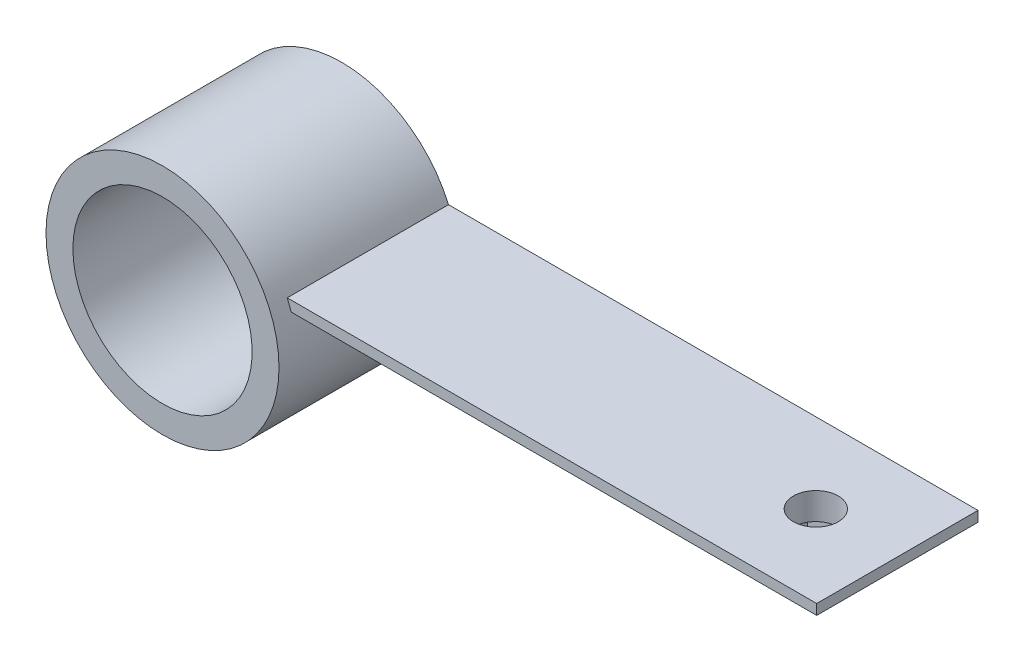
ISO-10303-21;
HEADER;
FILE_DESCRIPTION(('STEP AP214'),'2;1');
FILE_NAME('part.step','',(''),(''),'','','');
FILE_SCHEMA(('AUTOMOTIVE_DESIGN { 1 0 10303 214 1 1 1 1 }'));
ENDSEC;
DATA;
#1=APPLICATION_CONTEXT('core data for automotive mechanical design processes');
#2=APPLICATION_PROTOCOL_DEFINITION('international standard','automotive_design',2000,#1);
#3=PRODUCT_CONTEXT('',#1,'mechanical');
#4=PRODUCT('Part','Part','',(#3));
#5=PRODUCT_RELATED_PRODUCT_CATEGORY('part','',(#4));
#6=PRODUCT_DEFINITION_FORMATION('','',#4);
#7=PRODUCT_DEFINITION_CONTEXT('part definition',#1,'design');
#8=PRODUCT_DEFINITION('design','',#6,#7);
#9=PRODUCT_DEFINITION_SHAPE('','',#8);
#10=(LENGTH_UNIT() NAMED_UNIT(*) SI_UNIT(.MILLI.,.METRE.));
#11=(NAMED_UNIT(*) PLANE_ANGLE_UNIT() SI_UNIT($,.RADIAN.));
#12=(NAMED_UNIT(*) SI_UNIT($,.STERADIAN.) SOLID_ANGLE_UNIT());
#13=UNCERTAINTY_MEASURE_WITH_UNIT(LENGTH_MEASURE(1.E-05),#10,'distance_accuracy_value','');
#14=(GEOMETRIC_REPRESENTATION_CONTEXT(3) GLOBAL_UNCERTAINTY_ASSIGNED_CONTEXT((#13)) GLOBAL_UNIT_ASSIGNED_CONTEXT((#10,
#11,#12)) REPRESENTATION_CONTEXT('',''));
#15=CARTESIAN_POINT('',(0.,0.,0.));
#16=DIRECTION('',(0.,0.,1.));
#17=DIRECTION('',(1.,0.,0.));
#18=AXIS2_PLACEMENT_3D('',#15,#16,#17);
#19=CARTESIAN_POINT('',(-25.4,0.,3.81));
#20=DIRECTION('',(0.,-1.,0.));
#21=DIRECTION('',(0.,0.,-1.));
#22=AXIS2_PLACEMENT_3D('',#19,#20,#21);
#23=PLANE('',#22);
#24=CARTESIAN_POINT('',(-14.2191135768376,0.,11.3054432115813));
#25=DIRECTION('',(0.,-1.,0.));
#26=DIRECTION('',(0.,0.,-1.));
#27=AXIS2_PLACEMENT_3D('',#24,#25,#26);
#28=CIRCLE('',#27,3.175);
#29=CARTESIAN_POINT('',(-14.2191135768376,0.,8.13044321158129));
#30=VERTEX_POINT('',#29);
#31=EDGE_CURVE('E43',#30,#30,#28,.T.);
#32=ORIENTED_EDGE('',*,*,#31,.T.);
#33=EDGE_LOOP('',(#32));
#34=FACE_BOUND('',#33,.T.);
#35=DIRECTION('',(0.,0.,-1.));
#36=VECTOR('',#35,1.);
#37=CARTESIAN_POINT('',(-77.5762033844775,0.,25.4));
#38=LINE('',#37,#36);
#39=CARTESIAN_POINT('',(-77.5762033844775,0.,22.86));
#40=VERTEX_POINT('',#39);
#41=CARTESIAN_POINT('',(-77.5762033844775,0.,0.));
#42=VERTEX_POINT('',#41);
#43=EDGE_CURVE('E158',#40,#42,#38,.T.);
#44=ORIENTED_EDGE('',*,*,#43,.F.);
#45=DIRECTION('',(-1.,0.,0.));
#46=VECTOR('',#45,1.);
#47=CARTESIAN_POINT('',(-2.54,0.,22.86));
#48=LINE('',#47,#46);
#49=CARTESIAN_POINT('',(-2.54,0.,22.86));
#50=VERTEX_POINT('',#49);
#51=EDGE_CURVE('E140',#50,#40,#48,.T.);
#52=ORIENTED_EDGE('',*,*,#51,.F.);
#53=DIRECTION('',(0.,0.,-1.));
#54=VECTOR('',#53,1.);
#55=CARTESIAN_POINT('',(-2.54,0.,3.81));
#56=LINE('',#55,#54);
#57=CARTESIAN_POINT('',(-2.54,0.,0.));
#58=VERTEX_POINT('',#57);
#59=EDGE_CURVE('E266',#50,#58,#56,.T.);
#60=ORIENTED_EDGE('',*,*,#59,.T.);
#61=DIRECTION('',(-1.,0.,0.));
#62=VECTOR('',#61,1.);
#63=CARTESIAN_POINT('',(-25.4,0.,0.));
#64=LINE('',#63,#62);
#65=EDGE_CURVE('E167',#58,#42,#64,.T.);
#66=ORIENTED_EDGE('',*,*,#65,.T.);
#67=EDGE_LOOP('',(#44,#52,#60,#66));
#68=FACE_BOUND('',#67,.T.);
#69=ADVANCED_FACE('F39',(#34,#68),#23,.F.);
#70=CARTESIAN_POINT('',(-22.86,-3.81,22.86));
#71=DIRECTION('',(0.,1.,0.));
#72=DIRECTION('',(0.,0.,1.));
#73=AXIS2_PLACEMENT_3D('',#70,#71,#72);
#74=PLANE('',#73);
#75=CARTESIAN_POINT('',(-14.2191135768376,-3.81,11.3054432115813));
#76=DIRECTION('',(0.,-1.,0.));
#77=DIRECTION('',(0.,0.,-1.));
#78=AXIS2_PLACEMENT_3D('',#75,#76,#77);
#79=CIRCLE('',#78,3.175);
#80=CARTESIAN_POINT('',(-14.2191135768376,-3.81,8.13044321158129));
#81=VERTEX_POINT('',#80);
#82=EDGE_CURVE('E305',#81,#81,#79,.T.);
#83=ORIENTED_EDGE('',*,*,#82,.F.);
#84=EDGE_LOOP('',(#83));
#85=FACE_BOUND('',#84,.T.);
#86=DIRECTION('',(0.,0.,-1.));
#87=VECTOR('',#86,1.);
#88=CARTESIAN_POINT('',(-49.53,-3.81000000000006,3.81));
#89=LINE('',#88,#87);
#90=CARTESIAN_POINT('',(-49.53,-3.81000000000003,13.1982271536748));
#91=VERTEX_POINT('',#90);
#92=CARTESIAN_POINT('',(-49.53,-3.81000000000006,3.81));
#93=VERTEX_POINT('',#92);
#94=EDGE_CURVE('E187',#91,#93,#89,.T.);
#95=ORIENTED_EDGE('',*,*,#94,.T.);
#96=DIRECTION('',(1.,0.,0.));
#97=VECTOR('',#96,1.);
#98=CARTESIAN_POINT('',(-76.2,-3.81000000000002,3.81));
#99=LINE('',#98,#97);
#100=CARTESIAN_POINT('',(-25.4,-3.81000000000002,3.81));
#101=VERTEX_POINT('',#100);
#102=EDGE_CURVE('E238',#93,#101,#99,.T.);
#103=ORIENTED_EDGE('',*,*,#102,.T.);
#104=DIRECTION('',(0.,0.,1.));
#105=VECTOR('',#104,1.);
#106=CARTESIAN_POINT('',(-25.4,-3.81000000000002,22.86));
#107=LINE('',#106,#105);
#108=CARTESIAN_POINT('',(-25.4,-3.80999999999999,13.1982271536748));
#109=VERTEX_POINT('',#108);
#110=EDGE_CURVE('E234',#101,#109,#107,.T.);
#111=ORIENTED_EDGE('',*,*,#110,.T.);
#112=DIRECTION('',(1.,0.,0.));
#113=VECTOR('',#112,1.);
#114=CARTESIAN_POINT('',(-98.5726760431856,-3.81000000000002,13.1982271536748));
#115=LINE('',#114,#113);
#116=CARTESIAN_POINT('',(-22.86,-3.80999999999999,13.1982271536748));
#117=VERTEX_POINT('',#116);
#118=EDGE_CURVE('E203',#109,#117,#115,.T.);
#119=ORIENTED_EDGE('',*,*,#118,.T.);
#120=DIRECTION('',(0.,0.,-1.));
#121=VECTOR('',#120,1.);
#122=CARTESIAN_POINT('',(-22.86,-3.81,22.86));
#123=LINE('',#122,#121);
#124=CARTESIAN_POINT('',(-22.86,-3.81,3.81));
#125=VERTEX_POINT('',#124);
#126=EDGE_CURVE('E259',#117,#125,#123,.T.);
#127=ORIENTED_EDGE('',*,*,#126,.T.);
#128=DIRECTION('',(1.,0.,0.));
#129=VECTOR('',#128,1.);
#130=CARTESIAN_POINT('',(-22.86,-3.81,3.81));
#131=LINE('',#130,#129);
#132=CARTESIAN_POINT('',(-6.59911357683752,-3.81,3.81));
#133=VERTEX_POINT('',#132);
#134=EDGE_CURVE('E152',#125,#133,#131,.T.);
#135=ORIENTED_EDGE('',*,*,#134,.T.);
#136=DIRECTION('',(0.,0.,-1.));
#137=VECTOR('',#136,1.);
#138=CARTESIAN_POINT('',(-6.59911357683771,-3.81,22.86));
#139=LINE('',#138,#137);
#140=CARTESIAN_POINT('',(-6.59911357683753,-3.80999999999999,18.8008864231626));
#141=VERTEX_POINT('',#140);
#142=EDGE_CURVE('E64',#141,#133,#139,.T.);
#143=ORIENTED_EDGE('',*,*,#142,.F.);
#144=DIRECTION('',(1.,0.,0.));
#145=VECTOR('',#144,1.);
#146=CARTESIAN_POINT('',(-98.5726760431856,-3.81000000000002,18.8008864231626));
#147=LINE('',#146,#145);
#148=CARTESIAN_POINT('',(-76.4372944641802,-3.81000000000002,18.8008864231626));
#149=VERTEX_POINT('',#148);
#150=EDGE_CURVE('E211',#149,#141,#147,.T.);
#151=ORIENTED_EDGE('',*,*,#150,.F.);
#152=DIRECTION('',(0.,0.,1.));
#153=VECTOR('',#152,1.);
#154=CARTESIAN_POINT('',(-76.4372944641802,-3.81000000000002,-2.93108565109848));
#155=LINE('',#154,#153);
#156=CARTESIAN_POINT('',(-76.4372944641802,-3.81000000000002,3.81));
#157=VERTEX_POINT('',#156);
#158=EDGE_CURVE('E164',#157,#149,#155,.T.);
#159=ORIENTED_EDGE('',*,*,#158,.F.);
#160=CARTESIAN_POINT('',(-52.07,-3.81000000000002,3.81));
#161=VERTEX_POINT('',#160);
#162=EDGE_CURVE('E239',#157,#161,#99,.T.);
#163=ORIENTED_EDGE('',*,*,#162,.T.);
#164=DIRECTION('',(0.,0.,-1.));
#165=VECTOR('',#164,1.);
#166=CARTESIAN_POINT('',(-52.07,-3.81000000000006,3.81));
#167=LINE('',#166,#165);
#168=CARTESIAN_POINT('',(-52.07,-3.81000000000003,13.1982271536748));
#169=VERTEX_POINT('',#168);
#170=EDGE_CURVE('E56',#169,#161,#167,.T.);
#171=ORIENTED_EDGE('',*,*,#170,.F.);
#172=DIRECTION('',(-1.,0.,0.));
#173=VECTOR('',#172,1.);
#174=CARTESIAN_POINT('',(-49.53,-3.81000000000003,13.1982271536748));
#175=LINE('',#174,#173);
#176=EDGE_CURVE('E200',#91,#169,#175,.T.);
#177=ORIENTED_EDGE('',*,*,#176,.F.);
#178=EDGE_LOOP('',(#95,#103,#111,#119,#127,#135,#143,#151,#159,#163,#171,#177));
#179=FACE_BOUND('',#178,.T.);
#180=ADVANCED_FACE('F322',(#85,#179),#74,.F.);
#181=CARTESIAN_POINT('',(-76.2,-13.1982271536747,3.81));
#182=DIRECTION('',(0.,0.,-1.));
#183=DIRECTION('',(-1.,0.,0.));
#184=AXIS2_PLACEMENT_3D('',#181,#182,#183);
#185=PLANE('',#184);
#186=DIRECTION('',(0.,-1.,0.));
#187=VECTOR('',#186,1.);
#188=CARTESIAN_POINT('',(-49.53,-13.1982271536747,3.81));
#189=LINE('',#188,#187);
#190=CARTESIAN_POINT('',(-49.53,-13.1982271536747,3.81));
#191=VERTEX_POINT('',#190);
#192=EDGE_CURVE('E191',#93,#191,#189,.T.);
#193=ORIENTED_EDGE('',*,*,#192,.T.);
#194=DIRECTION('',(1.,0.,0.));
#195=VECTOR('',#194,1.);
#196=CARTESIAN_POINT('',(-76.2,-13.1982271536747,3.81));
#197=LINE('',#196,#195);
#198=CARTESIAN_POINT('',(-25.4,-13.1982271536747,3.81));
#199=VERTEX_POINT('',#198);
#200=EDGE_CURVE('E243',#191,#199,#197,.T.);
#201=ORIENTED_EDGE('',*,*,#200,.T.);
#202=DIRECTION('',(0.,1.,0.));
#203=VECTOR('',#202,1.);
#204=CARTESIAN_POINT('',(-25.4,-13.1982271536747,3.81));
#205=LINE('',#204,#203);
#206=EDGE_CURVE('E230',#199,#101,#205,.T.);
#207=ORIENTED_EDGE('',*,*,#206,.T.);
#208=ORIENTED_EDGE('',*,*,#102,.F.);
#209=EDGE_LOOP('',(#193,#201,#207,#208));
#210=FACE_BOUND('',#209,.T.);
#211=ADVANCED_FACE('F340',(#210),#185,.F.);
#212=CARTESIAN_POINT('',(-25.4,-13.1982271536747,3.81));
#213=DIRECTION('',(1.,0.,0.));
#214=DIRECTION('',(0.,1.,0.));
#215=AXIS2_PLACEMENT_3D('',#212,#213,#214);
#216=PLANE('',#215);
#217=ORIENTED_EDGE('',*,*,#206,.F.);
#218=DIRECTION('',(0.,0.707106781186544,0.707106781186551));
#219=VECTOR('',#218,1.);
#220=CARTESIAN_POINT('',(-25.4,-13.1982271536747,3.81));
#221=LINE('',#220,#219);
#222=EDGE_CURVE('E226',#199,#109,#221,.T.);
#223=ORIENTED_EDGE('',*,*,#222,.T.);
#224=ORIENTED_EDGE('',*,*,#110,.F.);
#225=EDGE_LOOP('',(#217,#223,#224));
#226=FACE_BOUND('',#225,.T.);
#227=ADVANCED_FACE('F338',(#226),#216,.F.);
#228=CARTESIAN_POINT('',(0.,0.,3.81));
#229=DIRECTION('',(0.,0.,-1.));
#230=DIRECTION('',(-1.,0.,0.));
#231=AXIS2_PLACEMENT_3D('',#228,#229,#230);
#232=PLANE('',#231);
#233=ORIENTED_EDGE('',*,*,#134,.F.);
#234=DIRECTION('',(0.,1.,0.));
#235=VECTOR('',#234,1.);
#236=CARTESIAN_POINT('',(-22.86,-13.1982271536747,3.81));
#237=LINE('',#236,#235);
#238=CARTESIAN_POINT('',(-22.86,-13.1982271536747,3.81));
#239=VERTEX_POINT('',#238);
#240=EDGE_CURVE('E247',#239,#125,#237,.T.);
#241=ORIENTED_EDGE('',*,*,#240,.F.);
#242=DIRECTION('',(0.866025403784441,0.499999999999995,0.));
#243=VECTOR('',#242,1.);
#244=CARTESIAN_POINT('',(-2.53999999999999,-1.46646968374162,3.81));
#245=LINE('',#244,#243);
#246=EDGE_CURVE('E263',#239,#133,#245,.T.);
#247=ORIENTED_EDGE('',*,*,#246,.T.);
#248=EDGE_LOOP('',(#233,#241,#247));
#249=FACE_BOUND('',#248,.T.);
#250=ADVANCED_FACE('F327',(#249),#232,.F.);
#251=CARTESIAN_POINT('',(-25.4,-13.1982271536747,3.81));
#252=DIRECTION('',(0.,1.,0.));
#253=DIRECTION('',(-1.,0.,0.));
#254=AXIS2_PLACEMENT_3D('',#251,#252,#253);
#255=PLANE('',#254);
#256=CARTESIAN_POINT('',(-77.5762033844775,-13.1982271536747,3.81));
#257=VERTEX_POINT('',#256);
#258=CARTESIAN_POINT('',(-52.07,-13.1982271536747,3.81));
#259=VERTEX_POINT('',#258);
#260=EDGE_CURVE('E244',#257,#259,#197,.T.);
#261=ORIENTED_EDGE('',*,*,#260,.F.);
#262=DIRECTION('',(0.,0.,-1.));
#263=VECTOR('',#262,1.);
#264=CARTESIAN_POINT('',(-77.5762033844775,-13.1982271536747,25.4));
#265=LINE('',#264,#263);
#266=CARTESIAN_POINT('',(-77.5762033844775,-13.1982271536747,0.));
#267=VERTEX_POINT('',#266);
#268=EDGE_CURVE('E170',#257,#267,#265,.T.);
#269=ORIENTED_EDGE('',*,*,#268,.T.);
#270=DIRECTION('',(1.,0.,0.));
#271=VECTOR('',#270,1.);
#272=CARTESIAN_POINT('',(-25.4,-13.1982271536747,0.));
#273=LINE('',#272,#271);
#274=CARTESIAN_POINT('',(-22.86,-13.1982271536747,0.));
#275=VERTEX_POINT('',#274);
#276=EDGE_CURVE('E262',#267,#275,#273,.T.);
#277=ORIENTED_EDGE('',*,*,#276,.T.);
#278=DIRECTION('',(0.,0.,-1.));
#279=VECTOR('',#278,1.);
#280=CARTESIAN_POINT('',(-22.86,-13.1982271536747,3.81));
#281=LINE('',#280,#279);
#282=EDGE_CURVE('E11',#239,#275,#281,.T.);
#283=ORIENTED_EDGE('',*,*,#282,.F.);
#284=DIRECTION('',(1.,0.,0.));
#285=VECTOR('',#284,1.);
#286=CARTESIAN_POINT('',(-98.5726760431856,-13.1982271536747,3.81));
#287=LINE('',#286,#285);
#288=EDGE_CURVE('E210',#199,#239,#287,.T.);
#289=ORIENTED_EDGE('',*,*,#288,.F.);
#290=ORIENTED_EDGE('',*,*,#200,.F.);
#291=DIRECTION('',(-1.,0.,0.));
#292=VECTOR('',#291,1.);
#293=CARTESIAN_POINT('',(-49.53,-13.1982271536747,3.81));
#294=LINE('',#293,#292);
#295=EDGE_CURVE('E199',#191,#259,#294,.T.);
#296=ORIENTED_EDGE('',*,*,#295,.T.);
#297=EDGE_LOOP('',(#261,#269,#277,#283,#289,#290,#296));
#298=FACE_BOUND('',#297,.T.);
#299=ADVANCED_FACE('F41',(#298),#255,.F.);
#300=CARTESIAN_POINT('',(-2.53999999999999,-1.46646968374162,3.81));
#301=DIRECTION('',(-0.499999999999995,0.866025403784442,0.));
#302=DIRECTION('',(-0.866025403784442,-0.499999999999995,0.));
#303=AXIS2_PLACEMENT_3D('',#300,#301,#302);
#304=PLANE('',#303);
#305=DIRECTION('',(0.,0.,-1.));
#306=VECTOR('',#305,1.);
#307=CARTESIAN_POINT('',(-2.53999999999999,-1.46646968374162,3.81));
#308=LINE('',#307,#306);
#309=CARTESIAN_POINT('',(-2.53999999999995,-1.46646968374161,22.86));
#310=VERTEX_POINT('',#309);
#311=CARTESIAN_POINT('',(-2.53999999999999,-1.46646968374162,0.));
#312=VERTEX_POINT('',#311);
#313=EDGE_CURVE('E49',#310,#312,#308,.T.);
#314=ORIENTED_EDGE('',*,*,#313,.F.);
#315=DIRECTION('',(-0.654653670707985,-0.377964473009227,-0.654653670707969));
#316=VECTOR('',#315,1.);
#317=CARTESIAN_POINT('',(-10.7042857142857,-6.18012223862543,14.6957142857145));
#318=LINE('',#317,#316);
#319=EDGE_CURVE('E219',#310,#141,#318,.T.);
#320=ORIENTED_EDGE('',*,*,#319,.T.);
#321=ORIENTED_EDGE('',*,*,#142,.T.);
#322=ORIENTED_EDGE('',*,*,#246,.F.);
#323=ORIENTED_EDGE('',*,*,#282,.T.);
#324=DIRECTION('',(0.866025403784441,0.499999999999995,0.));
#325=VECTOR('',#324,1.);
#326=CARTESIAN_POINT('',(-2.53999999999999,-1.46646968374162,0.));
#327=LINE('',#326,#325);
#328=EDGE_CURVE('E270',#275,#312,#327,.T.);
#329=ORIENTED_EDGE('',*,*,#328,.T.);
#330=EDGE_LOOP('',(#314,#320,#321,#322,#323,#329));
#331=FACE_BOUND('',#330,.T.);
#332=ADVANCED_FACE('F321',(#331),#304,.F.);
#333=CARTESIAN_POINT('',(-2.54,0.,3.81));
#334=DIRECTION('',(-1.,0.,0.));
#335=DIRECTION('',(0.,-1.,0.));
#336=AXIS2_PLACEMENT_3D('',#333,#334,#335);
#337=PLANE('',#336);
#338=DIRECTION('',(0.,1.,0.));
#339=VECTOR('',#338,1.);
#340=CARTESIAN_POINT('',(-2.54,0.,0.));
#341=LINE('',#340,#339);
#342=EDGE_CURVE('E273',#312,#58,#341,.T.);
#343=ORIENTED_EDGE('',*,*,#342,.T.);
#344=ORIENTED_EDGE('',*,*,#59,.F.);
#345=DIRECTION('',(0.,1.,0.));
#346=VECTOR('',#345,1.);
#347=CARTESIAN_POINT('',(-2.53999999999998,-1.46646968374162,22.86));
#348=LINE('',#347,#346);
#349=EDGE_CURVE('E147',#310,#50,#348,.T.);
#350=ORIENTED_EDGE('',*,*,#349,.F.);
#351=ORIENTED_EDGE('',*,*,#313,.T.);
#352=EDGE_LOOP('',(#343,#344,#350,#351));
#353=FACE_BOUND('',#352,.T.);
#354=ADVANCED_FACE('F285',(#353),#337,.F.);
#355=CARTESIAN_POINT('',(0.,0.,0.));
#356=DIRECTION('',(0.,0.,-1.));
#357=DIRECTION('',(-1.,0.,0.));
#358=AXIS2_PLACEMENT_3D('',#355,#356,#357);
#359=PLANE('',#358);
#360=ORIENTED_EDGE('',*,*,#276,.F.);
#361=CARTESIAN_POINT('',(-92.71,-6.59911357683735,0.));
#362=DIRECTION('',(0.,0.,-1.));
#363=DIRECTION('',(-1.,0.,0.));
#364=AXIS2_PLACEMENT_3D('',#361,#362,#363);
#365=CIRCLE('',#364,16.51);
#366=EDGE_CURVE('E179',#267,#42,#365,.T.);
#367=ORIENTED_EDGE('',*,*,#366,.T.);
#368=ORIENTED_EDGE('',*,*,#65,.F.);
#369=ORIENTED_EDGE('',*,*,#342,.F.);
#370=ORIENTED_EDGE('',*,*,#328,.F.);
#371=EDGE_LOOP('',(#360,#367,#368,#369,#370));
#372=FACE_BOUND('',#371,.T.);
#373=CARTESIAN_POINT('',(-92.71,-6.59911357683735,0.));
#374=DIRECTION('',(0.,0.,-1.));
#375=DIRECTION('',(-1.,0.,0.));
#376=AXIS2_PLACEMENT_3D('',#373,#374,#375);
#377=CIRCLE('',#376,12.7);
#378=CARTESIAN_POINT('',(-105.41,-6.59911357683735,0.));
#379=VERTEX_POINT('',#378);
#380=EDGE_CURVE('E297',#379,#379,#377,.T.);
#381=ORIENTED_EDGE('',*,*,#380,.F.);
#382=EDGE_LOOP('',(#381));
#383=FACE_BOUND('',#382,.T.);
#384=ADVANCED_FACE('F288',(#372,#383),#359,.T.);
#385=CARTESIAN_POINT('',(-22.86,-13.1982271536747,22.86));
#386=DIRECTION('',(-1.,0.,0.));
#387=DIRECTION('',(0.,0.,1.));
#388=AXIS2_PLACEMENT_3D('',#385,#386,#387);
#389=PLANE('',#388);
#390=ORIENTED_EDGE('',*,*,#126,.F.);
#391=DIRECTION('',(0.,-0.707106781186544,-0.707106781186551));
#392=VECTOR('',#391,1.);
#393=CARTESIAN_POINT('',(-22.86,-3.67322715367466,13.3350000000001));
#394=LINE('',#393,#392);
#395=EDGE_CURVE('E222',#117,#239,#394,.T.);
#396=ORIENTED_EDGE('',*,*,#395,.T.);
#397=ORIENTED_EDGE('',*,*,#240,.T.);
#398=EDGE_LOOP('',(#390,#396,#397));
#399=FACE_BOUND('',#398,.T.);
#400=ADVANCED_FACE('F329',(#399),#389,.F.);
#401=CARTESIAN_POINT('',(0.,0.,22.86));
#402=DIRECTION('',(0.,0.,1.));
#403=DIRECTION('',(1.,0.,0.));
#404=AXIS2_PLACEMENT_3D('',#401,#402,#403);
#405=PLANE('',#404);
#406=DIRECTION('',(1.,0.,0.));
#407=VECTOR('',#406,1.);
#408=CARTESIAN_POINT('',(-98.5726760431856,-1.46646968374165,22.86));
#409=LINE('',#408,#407);
#410=CARTESIAN_POINT('',(-77.0180891327198,-1.46646968374164,22.86));
#411=VERTEX_POINT('',#410);
#412=EDGE_CURVE('E207',#411,#310,#409,.T.);
#413=ORIENTED_EDGE('',*,*,#412,.T.);
#414=ORIENTED_EDGE('',*,*,#349,.T.);
#415=ORIENTED_EDGE('',*,*,#51,.T.);
#416=CARTESIAN_POINT('',(-92.71,-6.59911357683735,22.86));
#417=DIRECTION('',(0.,0.,1.));
#418=DIRECTION('',(1.,0.,0.));
#419=AXIS2_PLACEMENT_3D('',#416,#417,#418);
#420=CIRCLE('',#419,16.51);
#421=EDGE_CURVE('E144',#411,#40,#420,.T.);
#422=ORIENTED_EDGE('',*,*,#421,.F.);
#423=EDGE_LOOP('',(#413,#414,#415,#422));
#424=FACE_BOUND('',#423,.T.);
#425=ADVANCED_FACE('F143',(#424),#405,.T.);
#426=ORIENTED_EDGE('',*,*,#260,.T.);
#427=DIRECTION('',(0.,-1.,0.));
#428=VECTOR('',#427,1.);
#429=CARTESIAN_POINT('',(-52.07,-13.1982271536747,3.81));
#430=LINE('',#429,#428);
#431=EDGE_CURVE('E174',#161,#259,#430,.T.);
#432=ORIENTED_EDGE('',*,*,#431,.F.);
#433=ORIENTED_EDGE('',*,*,#162,.F.);
#434=CARTESIAN_POINT('',(-92.71,-6.59911357683735,3.81));
#435=DIRECTION('',(0.,0.,-1.));
#436=DIRECTION('',(-1.,0.,0.));
#437=AXIS2_PLACEMENT_3D('',#434,#435,#436);
#438=CIRCLE('',#437,16.51);
#439=EDGE_CURVE('E311',#257,#157,#438,.F.);
#440=ORIENTED_EDGE('',*,*,#439,.F.);
#441=EDGE_LOOP('',(#426,#432,#433,#440));
#442=FACE_BOUND('',#441,.T.);
#443=ADVANCED_FACE('F346',(#442),#185,.F.);
#444=CARTESIAN_POINT('',(-98.5726760431856,-13.1982271536747,3.81));
#445=DIRECTION('',(0.,0.707106781186551,-0.707106781186544));
#446=DIRECTION('',(0.,0.707106781186544,0.707106781186551));
#447=AXIS2_PLACEMENT_3D('',#444,#445,#446);
#448=PLANE('',#447);
#449=ORIENTED_EDGE('',*,*,#288,.T.);
#450=ORIENTED_EDGE('',*,*,#395,.F.);
#451=ORIENTED_EDGE('',*,*,#118,.F.);
#452=ORIENTED_EDGE('',*,*,#222,.F.);
#453=EDGE_LOOP('',(#449,#450,#451,#452));
#454=FACE_BOUND('',#453,.T.);
#455=ADVANCED_FACE('F331',(#454),#448,.F.);
#456=CARTESIAN_POINT('',(-98.5726760431856,-1.46646968374165,22.86));
#457=DIRECTION('',(0.,0.866025403784436,-0.500000000000004));
#458=DIRECTION('',(0.,0.500000000000004,0.866025403784436));
#459=AXIS2_PLACEMENT_3D('',#456,#457,#458);
#460=PLANE('',#459);
#461=CARTESIAN_POINT('',(-92.71,-6.59911357683735,13.9700000000002));
#462=DIRECTION('',(0.,0.866025403784436,-0.500000000000004));
#463=DIRECTION('',(0.,0.500000000000004,0.866025403784436));
#464=AXIS2_PLACEMENT_3D('',#461,#462,#463);
#465=ELLIPSE('',#464,33.0199999999997,16.51);
#466=EDGE_CURVE('E162',#149,#411,#465,.F.);
#467=ORIENTED_EDGE('',*,*,#466,.F.);
#468=ORIENTED_EDGE('',*,*,#150,.T.);
#469=ORIENTED_EDGE('',*,*,#319,.F.);
#470=ORIENTED_EDGE('',*,*,#412,.F.);
#471=EDGE_LOOP('',(#467,#468,#469,#470));
#472=FACE_BOUND('',#471,.T.);
#473=ADVANCED_FACE('F320',(#472),#460,.F.);
#474=CARTESIAN_POINT('',(-49.53,-3.81000000000003,13.1982271536748));
#475=DIRECTION('',(0.,-0.707106781186551,0.707106781186544));
#476=DIRECTION('',(0.,-0.707106781186544,-0.707106781186551));
#477=AXIS2_PLACEMENT_3D('',#474,#475,#476);
#478=PLANE('',#477);
#479=ORIENTED_EDGE('',*,*,#176,.T.);
#480=DIRECTION('',(0.,0.707106781186544,0.707106781186551));
#481=VECTOR('',#480,1.);
#482=CARTESIAN_POINT('',(-52.07,-3.81000000000003,13.1982271536748));
#483=LINE('',#482,#481);
#484=EDGE_CURVE('E184',#259,#169,#483,.T.);
#485=ORIENTED_EDGE('',*,*,#484,.F.);
#486=ORIENTED_EDGE('',*,*,#295,.F.);
#487=DIRECTION('',(0.,0.707106781186544,0.707106781186551));
#488=VECTOR('',#487,1.);
#489=CARTESIAN_POINT('',(-49.53,-3.81000000000003,13.1982271536748));
#490=LINE('',#489,#488);
#491=EDGE_CURVE('E195',#191,#91,#490,.T.);
#492=ORIENTED_EDGE('',*,*,#491,.T.);
#493=EDGE_LOOP('',(#479,#485,#486,#492));
#494=FACE_BOUND('',#493,.T.);
#495=ADVANCED_FACE('F350',(#494),#478,.T.);
#496=CARTESIAN_POINT('',(-49.53,0.,0.));
#497=DIRECTION('',(-1.,0.,0.));
#498=DIRECTION('',(0.,-1.,0.));
#499=AXIS2_PLACEMENT_3D('',#496,#497,#498);
#500=PLANE('',#499);
#501=ORIENTED_EDGE('',*,*,#94,.F.);
#502=ORIENTED_EDGE('',*,*,#491,.F.);
#503=ORIENTED_EDGE('',*,*,#192,.F.);
#504=EDGE_LOOP('',(#501,#502,#503));
#505=FACE_BOUND('',#504,.T.);
#506=ADVANCED_FACE('F354',(#505),#500,.F.);
#507=CARTESIAN_POINT('',(-52.07,0.,0.));
#508=DIRECTION('',(-1.,0.,0.));
#509=DIRECTION('',(0.,-1.,0.));
#510=AXIS2_PLACEMENT_3D('',#507,#508,#509);
#511=PLANE('',#510);
#512=ORIENTED_EDGE('',*,*,#170,.T.);
#513=ORIENTED_EDGE('',*,*,#431,.T.);
#514=ORIENTED_EDGE('',*,*,#484,.T.);
#515=EDGE_LOOP('',(#512,#513,#514));
#516=FACE_BOUND('',#515,.T.);
#517=ADVANCED_FACE('F352',(#516),#511,.T.);
#518=CARTESIAN_POINT('',(-92.71,-6.59911357683735,25.4));
#519=DIRECTION('',(0.,0.,-1.));
#520=DIRECTION('',(-1.,0.,0.));
#521=AXIS2_PLACEMENT_3D('',#518,#519,#520);
#522=CYLINDRICAL_SURFACE('',#521,16.51);
#523=ORIENTED_EDGE('',*,*,#421,.T.);
#524=ORIENTED_EDGE('',*,*,#43,.T.);
#525=ORIENTED_EDGE('',*,*,#366,.F.);
#526=ORIENTED_EDGE('',*,*,#268,.F.);
#527=ORIENTED_EDGE('',*,*,#439,.T.);
#528=ORIENTED_EDGE('',*,*,#158,.T.);
#529=ORIENTED_EDGE('',*,*,#466,.T.);
#530=EDGE_LOOP('',(#523,#524,#525,#526,#527,#528,#529));
#531=FACE_BOUND('',#530,.T.);
#532=CARTESIAN_POINT('',(-92.71,-6.59911357683735,25.4));
#533=DIRECTION('',(0.,0.,-1.));
#534=DIRECTION('',(-1.,0.,0.));
#535=AXIS2_PLACEMENT_3D('',#532,#533,#534);
#536=CIRCLE('',#535,16.51);
#537=CARTESIAN_POINT('',(-109.22,-6.59911357683735,25.4));
#538=VERTEX_POINT('',#537);
#539=EDGE_CURVE('E176',#538,#538,#536,.T.);
#540=ORIENTED_EDGE('',*,*,#539,.T.);
#541=EDGE_LOOP('',(#540));
#542=FACE_BOUND('',#541,.T.);
#543=ADVANCED_FACE('F155',(#531,#542),#522,.T.);
#544=CARTESIAN_POINT('',(-92.71,-6.59911357683735,25.4));
#545=DIRECTION('',(0.,0.,-1.));
#546=DIRECTION('',(-1.,0.,0.));
#547=AXIS2_PLACEMENT_3D('',#544,#545,#546);
#548=PLANE('',#547);
#549=CARTESIAN_POINT('',(-92.71,-6.59911357683735,25.4));
#550=DIRECTION('',(0.,0.,-1.));
#551=DIRECTION('',(-1.,0.,0.));
#552=AXIS2_PLACEMENT_3D('',#549,#550,#551);
#553=CIRCLE('',#552,12.7);
#554=CARTESIAN_POINT('',(-105.41,-6.59911357683735,25.4));
#555=VERTEX_POINT('',#554);
#556=EDGE_CURVE('E292',#555,#555,#553,.T.);
#557=ORIENTED_EDGE('',*,*,#556,.T.);
#558=EDGE_LOOP('',(#557));
#559=FACE_BOUND('',#558,.T.);
#560=ORIENTED_EDGE('',*,*,#539,.F.);
#561=EDGE_LOOP('',(#560));
#562=FACE_BOUND('',#561,.T.);
#563=ADVANCED_FACE('F360',(#559,#562),#548,.F.);
#564=CARTESIAN_POINT('',(-92.71,-6.59911357683735,25.4));
#565=DIRECTION('',(0.,0.,-1.));
#566=DIRECTION('',(-1.,0.,0.));
#567=AXIS2_PLACEMENT_3D('',#564,#565,#566);
#568=CYLINDRICAL_SURFACE('',#567,12.7);
#569=ORIENTED_EDGE('',*,*,#556,.F.);
#570=EDGE_LOOP('',(#569));
#571=FACE_BOUND('',#570,.T.);
#572=ORIENTED_EDGE('',*,*,#380,.T.);
#573=EDGE_LOOP('',(#572));
#574=FACE_BOUND('',#573,.T.);
#575=ADVANCED_FACE('F432',(#571,#574),#568,.F.);
#576=CARTESIAN_POINT('',(-14.2191135768376,9.91088642316265,11.3054432115813));
#577=DIRECTION('',(0.,-1.,0.));
#578=DIRECTION('',(0.,0.,-1.));
#579=AXIS2_PLACEMENT_3D('',#576,#577,#578);
#580=CYLINDRICAL_SURFACE('',#579,3.175);
#581=ORIENTED_EDGE('',*,*,#82,.T.);
#582=EDGE_LOOP('',(#581));
#583=FACE_BOUND('',#582,.T.);
#584=ORIENTED_EDGE('',*,*,#31,.F.);
#585=EDGE_LOOP('',(#584));
#586=FACE_BOUND('',#585,.T.);
#587=ADVANCED_FACE('F437',(#583,#586),#580,.F.);
#588=CLOSED_SHELL('',(#69,#180,#211,#227,#250,#299,#332,#354,#384,#400,#425,#443,#455,#473,#495,
#506,#517,#543,#563,#575,#587));
#589=MANIFOLD_SOLID_BREP('B2',#588);
#590=ADVANCED_BREP_SHAPE_REPRESENTATION('',(#18,#589),#14);
#591=SHAPE_DEFINITION_REPRESENTATION(#9,#590);
ENDSEC;
END-ISO-10303-21;
